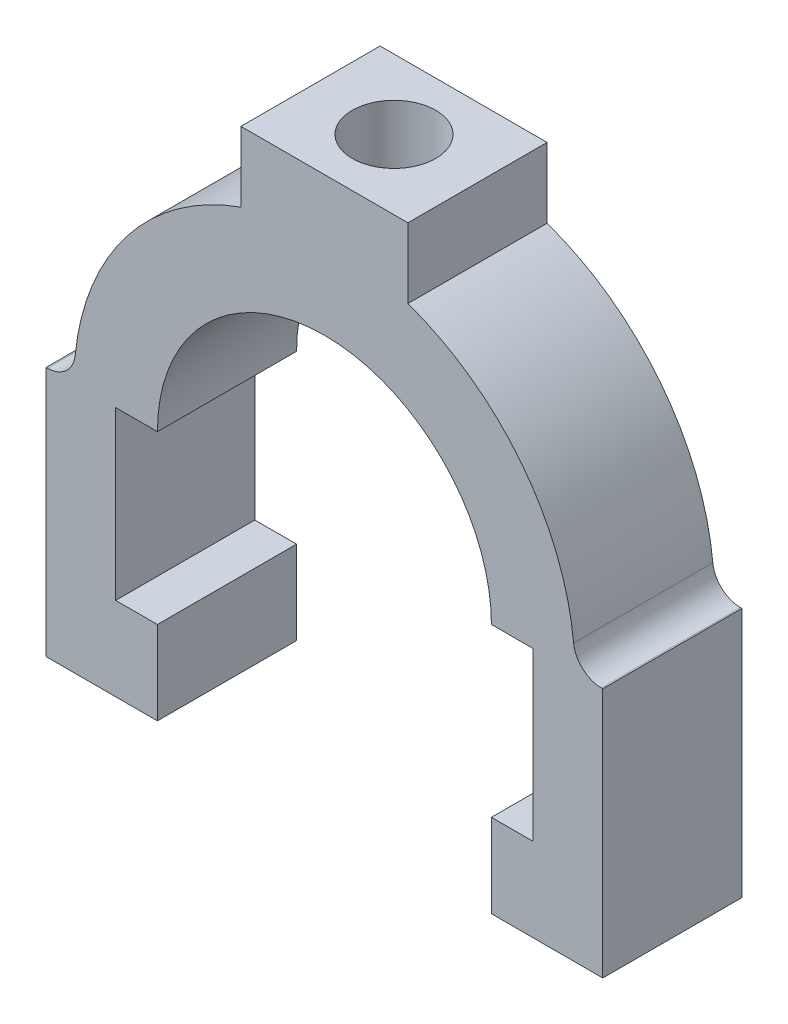
ISO-10303-21;
HEADER;
FILE_DESCRIPTION(('STEP AP214'),'2;1');
FILE_NAME('part.step','',(''),(''),'','','');
FILE_SCHEMA(('AUTOMOTIVE_DESIGN { 1 0 10303 214 1 1 1 1 }'));
ENDSEC;
DATA;
#1=APPLICATION_CONTEXT('core data for automotive mechanical design processes');
#2=APPLICATION_PROTOCOL_DEFINITION('international standard','automotive_design',2000,#1);
#3=PRODUCT_CONTEXT('',#1,'mechanical');
#4=PRODUCT('Part','Part','',(#3));
#5=PRODUCT_RELATED_PRODUCT_CATEGORY('part','',(#4));
#6=PRODUCT_DEFINITION_FORMATION('','',#4);
#7=PRODUCT_DEFINITION_CONTEXT('part definition',#1,'design');
#8=PRODUCT_DEFINITION('design','',#6,#7);
#9=PRODUCT_DEFINITION_SHAPE('','',#8);
#10=(LENGTH_UNIT() NAMED_UNIT(*) SI_UNIT(.MILLI.,.METRE.));
#11=(NAMED_UNIT(*) PLANE_ANGLE_UNIT() SI_UNIT($,.RADIAN.));
#12=(NAMED_UNIT(*) SI_UNIT($,.STERADIAN.) SOLID_ANGLE_UNIT());
#13=UNCERTAINTY_MEASURE_WITH_UNIT(LENGTH_MEASURE(1.E-05),#10,'distance_accuracy_value','');
#14=(GEOMETRIC_REPRESENTATION_CONTEXT(3) GLOBAL_UNCERTAINTY_ASSIGNED_CONTEXT((#13)) GLOBAL_UNIT_ASSIGNED_CONTEXT((#10,
#11,#12)) REPRESENTATION_CONTEXT('',''));
#15=CARTESIAN_POINT('',(0.,0.,0.));
#16=DIRECTION('',(0.,0.,1.));
#17=DIRECTION('',(1.,0.,0.));
#18=AXIS2_PLACEMENT_3D('',#15,#16,#17);
#19=CARTESIAN_POINT('',(0.,0.,-20.));
#20=DIRECTION('',(0.,-1.,0.));
#21=DIRECTION('',(1.,0.,0.));
#22=AXIS2_PLACEMENT_3D('',#19,#20,#21);
#23=PLANE('',#22);
#24=DIRECTION('',(1.,0.,0.));
#25=VECTOR('',#24,1.);
#26=CARTESIAN_POINT('',(0.,0.,0.));
#27=LINE('',#26,#25);
#28=CARTESIAN_POINT('',(-30.,0.,0.));
#29=VERTEX_POINT('',#28);
#30=CARTESIAN_POINT('',(-24.,0.,0.));
#31=VERTEX_POINT('',#30);
#32=EDGE_CURVE('E297',#29,#31,#27,.T.);
#33=ORIENTED_EDGE('',*,*,#32,.F.);
#34=DIRECTION('',(0.,0.,1.));
#35=VECTOR('',#34,1.);
#36=CARTESIAN_POINT('',(-30.,0.,-20.));
#37=LINE('',#36,#35);
#38=CARTESIAN_POINT('',(-30.,0.,-20.));
#39=VERTEX_POINT('',#38);
#40=EDGE_CURVE('E228',#39,#29,#37,.T.);
#41=ORIENTED_EDGE('',*,*,#40,.F.);
#42=DIRECTION('',(1.,0.,0.));
#43=VECTOR('',#42,1.);
#44=CARTESIAN_POINT('',(0.,0.,-20.));
#45=LINE('',#44,#43);
#46=CARTESIAN_POINT('',(-24.,0.,-20.));
#47=VERTEX_POINT('',#46);
#48=EDGE_CURVE('E222',#39,#47,#45,.T.);
#49=ORIENTED_EDGE('',*,*,#48,.T.);
#50=DIRECTION('',(0.,0.,1.));
#51=VECTOR('',#50,1.);
#52=CARTESIAN_POINT('',(-24.,0.,-20.));
#53=LINE('',#52,#51);
#54=EDGE_CURVE('E203',#47,#31,#53,.T.);
#55=ORIENTED_EDGE('',*,*,#54,.T.);
#56=EDGE_LOOP('',(#33,#41,#49,#55));
#57=FACE_BOUND('',#56,.T.);
#58=ADVANCED_FACE('F47',(#57),#23,.T.);
#59=CARTESIAN_POINT('',(-30.,0.,-20.));
#60=DIRECTION('',(1.,0.,0.));
#61=DIRECTION('',(0.,0.,-1.));
#62=AXIS2_PLACEMENT_3D('',#59,#60,#61);
#63=PLANE('',#62);
#64=DIRECTION('',(0.,1.,0.));
#65=VECTOR('',#64,1.);
#66=CARTESIAN_POINT('',(-30.,0.,0.));
#67=LINE('',#66,#65);
#68=CARTESIAN_POINT('',(-30.,-24.,0.));
#69=VERTEX_POINT('',#68);
#70=EDGE_CURVE('E230',#69,#29,#67,.T.);
#71=ORIENTED_EDGE('',*,*,#70,.F.);
#72=DIRECTION('',(0.,0.,1.));
#73=VECTOR('',#72,1.);
#74=CARTESIAN_POINT('',(-30.,-24.,-20.));
#75=LINE('',#74,#73);
#76=CARTESIAN_POINT('',(-30.,-24.,-20.));
#77=VERTEX_POINT('',#76);
#78=EDGE_CURVE('E363',#77,#69,#75,.T.);
#79=ORIENTED_EDGE('',*,*,#78,.F.);
#80=DIRECTION('',(0.,1.,0.));
#81=VECTOR('',#80,1.);
#82=CARTESIAN_POINT('',(-30.,0.,-20.));
#83=LINE('',#82,#81);
#84=EDGE_CURVE('E215',#77,#39,#83,.T.);
#85=ORIENTED_EDGE('',*,*,#84,.T.);
#86=ORIENTED_EDGE('',*,*,#40,.T.);
#87=EDGE_LOOP('',(#71,#79,#85,#86));
#88=FACE_BOUND('',#87,.T.);
#89=ADVANCED_FACE('F472',(#88),#63,.T.);
#90=CARTESIAN_POINT('',(0.,-24.,-20.));
#91=DIRECTION('',(0.,1.,0.));
#92=DIRECTION('',(-1.,0.,0.));
#93=AXIS2_PLACEMENT_3D('',#90,#91,#92);
#94=PLANE('',#93);
#95=DIRECTION('',(-1.,0.,0.));
#96=VECTOR('',#95,1.);
#97=CARTESIAN_POINT('',(0.,-24.,0.));
#98=LINE('',#97,#96);
#99=CARTESIAN_POINT('',(-24.,-24.,0.));
#100=VERTEX_POINT('',#99);
#101=EDGE_CURVE('E234',#100,#69,#98,.T.);
#102=ORIENTED_EDGE('',*,*,#101,.F.);
#103=DIRECTION('',(0.,0.,1.));
#104=VECTOR('',#103,1.);
#105=CARTESIAN_POINT('',(-24.,-24.,-20.));
#106=LINE('',#105,#104);
#107=CARTESIAN_POINT('',(-24.,-24.,-20.));
#108=VERTEX_POINT('',#107);
#109=EDGE_CURVE('E366',#108,#100,#106,.T.);
#110=ORIENTED_EDGE('',*,*,#109,.F.);
#111=DIRECTION('',(-1.,0.,0.));
#112=VECTOR('',#111,1.);
#113=CARTESIAN_POINT('',(0.,-24.,-20.));
#114=LINE('',#113,#112);
#115=EDGE_CURVE('E291',#108,#77,#114,.T.);
#116=ORIENTED_EDGE('',*,*,#115,.T.);
#117=ORIENTED_EDGE('',*,*,#78,.T.);
#118=EDGE_LOOP('',(#102,#110,#116,#117));
#119=FACE_BOUND('',#118,.T.);
#120=ADVANCED_FACE('F469',(#119),#94,.T.);
#121=CARTESIAN_POINT('',(-24.,0.,-20.));
#122=DIRECTION('',(1.,0.,0.));
#123=DIRECTION('',(0.,0.,-1.));
#124=AXIS2_PLACEMENT_3D('',#121,#122,#123);
#125=PLANE('',#124);
#126=DIRECTION('',(0.,1.,0.));
#127=VECTOR('',#126,1.);
#128=CARTESIAN_POINT('',(-24.,0.,0.));
#129=LINE('',#128,#127);
#130=CARTESIAN_POINT('',(-24.,-36.,0.));
#131=VERTEX_POINT('',#130);
#132=EDGE_CURVE('E353',#131,#100,#129,.T.);
#133=ORIENTED_EDGE('',*,*,#132,.F.);
#134=DIRECTION('',(0.,0.,1.));
#135=VECTOR('',#134,1.);
#136=CARTESIAN_POINT('',(-24.,-36.,-20.));
#137=LINE('',#136,#135);
#138=CARTESIAN_POINT('',(-24.,-36.,-20.));
#139=VERTEX_POINT('',#138);
#140=EDGE_CURVE('E369',#139,#131,#137,.T.);
#141=ORIENTED_EDGE('',*,*,#140,.F.);
#142=DIRECTION('',(0.,1.,0.));
#143=VECTOR('',#142,1.);
#144=CARTESIAN_POINT('',(-24.,0.,-20.));
#145=LINE('',#144,#143);
#146=EDGE_CURVE('E287',#139,#108,#145,.T.);
#147=ORIENTED_EDGE('',*,*,#146,.T.);
#148=ORIENTED_EDGE('',*,*,#109,.T.);
#149=EDGE_LOOP('',(#133,#141,#147,#148));
#150=FACE_BOUND('',#149,.T.);
#151=ADVANCED_FACE('F465',(#150),#125,.T.);
#152=CARTESIAN_POINT('',(0.,-36.,-20.));
#153=DIRECTION('',(0.,-1.,0.));
#154=DIRECTION('',(0.,0.,-1.));
#155=AXIS2_PLACEMENT_3D('',#152,#153,#154);
#156=PLANE('',#155);
#157=DIRECTION('',(1.,0.,0.));
#158=VECTOR('',#157,1.);
#159=CARTESIAN_POINT('',(0.,-36.,0.));
#160=LINE('',#159,#158);
#161=CARTESIAN_POINT('',(-40.,-36.,0.));
#162=VERTEX_POINT('',#161);
#163=EDGE_CURVE('E349',#162,#131,#160,.T.);
#164=ORIENTED_EDGE('',*,*,#163,.F.);
#165=DIRECTION('',(0.,0.,1.));
#166=VECTOR('',#165,1.);
#167=CARTESIAN_POINT('',(-40.,-36.,-20.));
#168=LINE('',#167,#166);
#169=CARTESIAN_POINT('',(-40.,-36.,-20.));
#170=VERTEX_POINT('',#169);
#171=EDGE_CURVE('E372',#170,#162,#168,.T.);
#172=ORIENTED_EDGE('',*,*,#171,.F.);
#173=DIRECTION('',(1.,0.,0.));
#174=VECTOR('',#173,1.);
#175=CARTESIAN_POINT('',(0.,-36.,-20.));
#176=LINE('',#175,#174);
#177=EDGE_CURVE('E283',#170,#139,#176,.T.);
#178=ORIENTED_EDGE('',*,*,#177,.T.);
#179=ORIENTED_EDGE('',*,*,#140,.T.);
#180=EDGE_LOOP('',(#164,#172,#178,#179));
#181=FACE_BOUND('',#180,.T.);
#182=ADVANCED_FACE('F461',(#181),#156,.T.);
#183=CARTESIAN_POINT('',(-40.,0.,-20.));
#184=DIRECTION('',(-1.,0.,0.));
#185=DIRECTION('',(0.,-1.,0.));
#186=AXIS2_PLACEMENT_3D('',#183,#184,#185);
#187=PLANE('',#186);
#188=DIRECTION('',(0.,-1.,0.));
#189=VECTOR('',#188,1.);
#190=CARTESIAN_POINT('',(-40.,0.,0.));
#191=LINE('',#190,#189);
#192=CARTESIAN_POINT('',(-40.,0.,0.));
#193=VERTEX_POINT('',#192);
#194=EDGE_CURVE('E345',#193,#162,#191,.T.);
#195=ORIENTED_EDGE('',*,*,#194,.F.);
#196=DIRECTION('',(0.,0.,1.));
#197=VECTOR('',#196,1.);
#198=CARTESIAN_POINT('',(-40.,0.,-20.));
#199=LINE('',#198,#197);
#200=CARTESIAN_POINT('',(-40.,0.,-20.));
#201=VERTEX_POINT('',#200);
#202=EDGE_CURVE('E375',#201,#193,#199,.T.);
#203=ORIENTED_EDGE('',*,*,#202,.F.);
#204=DIRECTION('',(0.,-1.,0.));
#205=VECTOR('',#204,1.);
#206=CARTESIAN_POINT('',(-40.,0.,-20.));
#207=LINE('',#206,#205);
#208=EDGE_CURVE('E279',#201,#170,#207,.T.);
#209=ORIENTED_EDGE('',*,*,#208,.T.);
#210=ORIENTED_EDGE('',*,*,#171,.T.);
#211=EDGE_LOOP('',(#195,#203,#209,#210));
#212=FACE_BOUND('',#211,.T.);
#213=ADVANCED_FACE('F457',(#212),#187,.T.);
#214=CARTESIAN_POINT('',(0.,0.,-20.));
#215=DIRECTION('',(0.,1.,0.));
#216=DIRECTION('',(-1.,0.,0.));
#217=AXIS2_PLACEMENT_3D('',#214,#215,#216);
#218=PLANE('',#217);
#219=DIRECTION('',(-1.,0.,0.));
#220=VECTOR('',#219,1.);
#221=CARTESIAN_POINT('',(0.,0.,0.));
#222=LINE('',#221,#220);
#223=CARTESIAN_POINT('',(-39.7994974842648,0.,0.));
#224=VERTEX_POINT('',#223);
#225=EDGE_CURVE('E342',#224,#193,#222,.T.);
#226=ORIENTED_EDGE('',*,*,#225,.F.);
#227=DIRECTION('',(0.,0.,1.));
#228=VECTOR('',#227,1.);
#229=CARTESIAN_POINT('',(-39.7994974842648,0.,-20.));
#230=LINE('',#229,#228);
#231=CARTESIAN_POINT('',(-39.7994974842648,0.,-20.));
#232=VERTEX_POINT('',#231);
#233=EDGE_CURVE('E421',#224,#232,#230,.F.);
#234=ORIENTED_EDGE('',*,*,#233,.T.);
#235=DIRECTION('',(-1.,0.,0.));
#236=VECTOR('',#235,1.);
#237=CARTESIAN_POINT('',(0.,0.,-20.));
#238=LINE('',#237,#236);
#239=EDGE_CURVE('E276',#232,#201,#238,.T.);
#240=ORIENTED_EDGE('',*,*,#239,.T.);
#241=ORIENTED_EDGE('',*,*,#202,.T.);
#242=EDGE_LOOP('',(#226,#234,#240,#241));
#243=FACE_BOUND('',#242,.T.);
#244=ADVANCED_FACE('F453',(#243),#218,.T.);
#245=CARTESIAN_POINT('',(0.,0.,-20.));
#246=DIRECTION('',(0.,0.,1.));
#247=DIRECTION('',(1.,0.,0.));
#248=AXIS2_PLACEMENT_3D('',#245,#246,#247);
#249=CYLINDRICAL_SURFACE('',#248,36.);
#250=CARTESIAN_POINT('',(0.,0.,-20.));
#251=DIRECTION('',(0.,0.,1.));
#252=DIRECTION('',(1.,0.,0.));
#253=AXIS2_PLACEMENT_3D('',#250,#251,#252);
#254=CIRCLE('',#253,36.);
#255=CARTESIAN_POINT('',(-35.8195477358383,3.6,-20.));
#256=VERTEX_POINT('',#255);
#257=CARTESIAN_POINT('',(-12.,33.9411254969543,-20.));
#258=VERTEX_POINT('',#257);
#259=EDGE_CURVE('E273',#256,#258,#254,.F.);
#260=ORIENTED_EDGE('',*,*,#259,.F.);
#261=DIRECTION('',(0.,0.,1.));
#262=VECTOR('',#261,1.);
#263=CARTESIAN_POINT('',(-35.8195477358383,3.6,-20.));
#264=LINE('',#263,#262);
#265=CARTESIAN_POINT('',(-35.8195477358383,3.6,0.));
#266=VERTEX_POINT('',#265);
#267=EDGE_CURVE('E362',#256,#266,#264,.T.);
#268=ORIENTED_EDGE('',*,*,#267,.T.);
#269=CARTESIAN_POINT('',(0.,0.,0.));
#270=DIRECTION('',(0.,0.,1.));
#271=DIRECTION('',(1.,0.,0.));
#272=AXIS2_PLACEMENT_3D('',#269,#270,#271);
#273=CIRCLE('',#272,36.);
#274=CARTESIAN_POINT('',(-12.,33.9411254969543,0.));
#275=VERTEX_POINT('',#274);
#276=EDGE_CURVE('E339',#266,#275,#273,.F.);
#277=ORIENTED_EDGE('',*,*,#276,.T.);
#278=DIRECTION('',(0.,0.,1.));
#279=VECTOR('',#278,1.);
#280=CARTESIAN_POINT('',(-12.,33.9411254969543,-20.));
#281=LINE('',#280,#279);
#282=EDGE_CURVE('E379',#258,#275,#281,.T.);
#283=ORIENTED_EDGE('',*,*,#282,.F.);
#284=EDGE_LOOP('',(#260,#268,#277,#283));
#285=FACE_BOUND('',#284,.T.);
#286=ADVANCED_FACE('F447',(#285),#249,.T.);
#287=CARTESIAN_POINT('',(-12.,0.,-20.));
#288=DIRECTION('',(-1.,0.,0.));
#289=DIRECTION('',(0.,-1.,0.));
#290=AXIS2_PLACEMENT_3D('',#287,#288,#289);
#291=PLANE('',#290);
#292=DIRECTION('',(0.,-1.,0.));
#293=VECTOR('',#292,1.);
#294=CARTESIAN_POINT('',(-12.,0.,0.));
#295=LINE('',#294,#293);
#296=CARTESIAN_POINT('',(-12.,44.,0.));
#297=VERTEX_POINT('',#296);
#298=EDGE_CURVE('E335',#297,#275,#295,.T.);
#299=ORIENTED_EDGE('',*,*,#298,.F.);
#300=DIRECTION('',(0.,0.,1.));
#301=VECTOR('',#300,1.);
#302=CARTESIAN_POINT('',(-12.,44.,-20.));
#303=LINE('',#302,#301);
#304=CARTESIAN_POINT('',(-12.,44.,-20.));
#305=VERTEX_POINT('',#304);
#306=EDGE_CURVE('E383',#305,#297,#303,.T.);
#307=ORIENTED_EDGE('',*,*,#306,.F.);
#308=DIRECTION('',(0.,-1.,0.));
#309=VECTOR('',#308,1.);
#310=CARTESIAN_POINT('',(-12.,0.,-20.));
#311=LINE('',#310,#309);
#312=EDGE_CURVE('E269',#305,#258,#311,.T.);
#313=ORIENTED_EDGE('',*,*,#312,.T.);
#314=ORIENTED_EDGE('',*,*,#282,.T.);
#315=EDGE_LOOP('',(#299,#307,#313,#314));
#316=FACE_BOUND('',#315,.T.);
#317=ADVANCED_FACE('F519',(#316),#291,.T.);
#318=CARTESIAN_POINT('',(0.,44.,-20.));
#319=DIRECTION('',(0.,1.,0.));
#320=DIRECTION('',(0.,0.,1.));
#321=AXIS2_PLACEMENT_3D('',#318,#319,#320);
#322=PLANE('',#321);
#323=CARTESIAN_POINT('',(0.,44.,-10.));
#324=DIRECTION('',(0.,1.,0.));
#325=DIRECTION('',(0.,0.,1.));
#326=AXIS2_PLACEMENT_3D('',#323,#324,#325);
#327=CIRCLE('',#326,6.);
#328=CARTESIAN_POINT('',(0.,44.,-4.));
#329=VERTEX_POINT('',#328);
#330=EDGE_CURVE('E237',#329,#329,#327,.T.);
#331=ORIENTED_EDGE('',*,*,#330,.F.);
#332=EDGE_LOOP('',(#331));
#333=FACE_BOUND('',#332,.T.);
#334=DIRECTION('',(-1.,0.,0.));
#335=VECTOR('',#334,1.);
#336=CARTESIAN_POINT('',(0.,44.,0.));
#337=LINE('',#336,#335);
#338=CARTESIAN_POINT('',(12.,44.,0.));
#339=VERTEX_POINT('',#338);
#340=EDGE_CURVE('E331',#339,#297,#337,.T.);
#341=ORIENTED_EDGE('',*,*,#340,.F.);
#342=DIRECTION('',(0.,0.,1.));
#343=VECTOR('',#342,1.);
#344=CARTESIAN_POINT('',(12.,44.,-20.));
#345=LINE('',#344,#343);
#346=CARTESIAN_POINT('',(12.,44.,-20.));
#347=VERTEX_POINT('',#346);
#348=EDGE_CURVE('E386',#347,#339,#345,.T.);
#349=ORIENTED_EDGE('',*,*,#348,.F.);
#350=DIRECTION('',(-1.,0.,0.));
#351=VECTOR('',#350,1.);
#352=CARTESIAN_POINT('',(0.,44.,-20.));
#353=LINE('',#352,#351);
#354=EDGE_CURVE('E265',#347,#305,#353,.T.);
#355=ORIENTED_EDGE('',*,*,#354,.T.);
#356=ORIENTED_EDGE('',*,*,#306,.T.);
#357=EDGE_LOOP('',(#341,#349,#355,#356));
#358=FACE_BOUND('',#357,.T.);
#359=ADVANCED_FACE('F516',(#333,#358),#322,.T.);
#360=CARTESIAN_POINT('',(12.,0.,-20.));
#361=DIRECTION('',(-1.,0.,0.));
#362=DIRECTION('',(0.,-1.,0.));
#363=AXIS2_PLACEMENT_3D('',#360,#361,#362);
#364=PLANE('',#363);
#365=DIRECTION('',(0.,-1.,0.));
#366=VECTOR('',#365,1.);
#367=CARTESIAN_POINT('',(12.,0.,0.));
#368=LINE('',#367,#366);
#369=CARTESIAN_POINT('',(12.,33.9411254969543,0.));
#370=VERTEX_POINT('',#369);
#371=EDGE_CURVE('E328',#339,#370,#368,.T.);
#372=ORIENTED_EDGE('',*,*,#371,.T.);
#373=DIRECTION('',(0.,0.,1.));
#374=VECTOR('',#373,1.);
#375=CARTESIAN_POINT('',(12.,33.9411254969543,-20.));
#376=LINE('',#375,#374);
#377=CARTESIAN_POINT('',(12.,33.9411254969543,-20.));
#378=VERTEX_POINT('',#377);
#379=EDGE_CURVE('E389',#378,#370,#376,.T.);
#380=ORIENTED_EDGE('',*,*,#379,.F.);
#381=DIRECTION('',(0.,-1.,0.));
#382=VECTOR('',#381,1.);
#383=CARTESIAN_POINT('',(12.,0.,-20.));
#384=LINE('',#383,#382);
#385=EDGE_CURVE('E262',#347,#378,#384,.T.);
#386=ORIENTED_EDGE('',*,*,#385,.F.);
#387=ORIENTED_EDGE('',*,*,#348,.T.);
#388=EDGE_LOOP('',(#372,#380,#386,#387));
#389=FACE_BOUND('',#388,.T.);
#390=ADVANCED_FACE('F527',(#389),#364,.F.);
#391=CARTESIAN_POINT('',(0.,0.,-20.));
#392=DIRECTION('',(0.,0.,1.));
#393=DIRECTION('',(1.,0.,0.));
#394=AXIS2_PLACEMENT_3D('',#391,#392,#393);
#395=CYLINDRICAL_SURFACE('',#394,36.);
#396=CARTESIAN_POINT('',(0.,0.,0.));
#397=DIRECTION('',(0.,0.,1.));
#398=DIRECTION('',(1.,0.,0.));
#399=AXIS2_PLACEMENT_3D('',#396,#397,#398);
#400=CIRCLE('',#399,36.);
#401=CARTESIAN_POINT('',(35.8195477358383,3.6,0.));
#402=VERTEX_POINT('',#401);
#403=EDGE_CURVE('E325',#370,#402,#400,.F.);
#404=ORIENTED_EDGE('',*,*,#403,.T.);
#405=DIRECTION('',(0.,0.,1.));
#406=VECTOR('',#405,1.);
#407=CARTESIAN_POINT('',(35.8195477358383,3.6,-20.));
#408=LINE('',#407,#406);
#409=CARTESIAN_POINT('',(35.8195477358383,3.6,-20.));
#410=VERTEX_POINT('',#409);
#411=EDGE_CURVE('E69',#402,#410,#408,.F.);
#412=ORIENTED_EDGE('',*,*,#411,.T.);
#413=CARTESIAN_POINT('',(0.,0.,-20.));
#414=DIRECTION('',(0.,0.,1.));
#415=DIRECTION('',(1.,0.,0.));
#416=AXIS2_PLACEMENT_3D('',#413,#414,#415);
#417=CIRCLE('',#416,36.);
#418=EDGE_CURVE('E259',#378,#410,#417,.F.);
#419=ORIENTED_EDGE('',*,*,#418,.F.);
#420=ORIENTED_EDGE('',*,*,#379,.T.);
#421=EDGE_LOOP('',(#404,#412,#419,#420));
#422=FACE_BOUND('',#421,.T.);
#423=ADVANCED_FACE('F511',(#422),#395,.T.);
#424=CARTESIAN_POINT('',(0.,0.,-20.));
#425=DIRECTION('',(0.,-1.,0.));
#426=DIRECTION('',(1.,0.,0.));
#427=AXIS2_PLACEMENT_3D('',#424,#425,#426);
#428=PLANE('',#427);
#429=DIRECTION('',(1.,0.,0.));
#430=VECTOR('',#429,1.);
#431=CARTESIAN_POINT('',(0.,0.,-20.));
#432=LINE('',#431,#430);
#433=CARTESIAN_POINT('',(39.7994974842648,0.,-20.));
#434=VERTEX_POINT('',#433);
#435=CARTESIAN_POINT('',(40.,0.,-20.));
#436=VERTEX_POINT('',#435);
#437=EDGE_CURVE('E256',#434,#436,#432,.T.);
#438=ORIENTED_EDGE('',*,*,#437,.F.);
#439=DIRECTION('',(0.,0.,-1.));
#440=VECTOR('',#439,1.);
#441=CARTESIAN_POINT('',(39.7994974842648,0.,0.));
#442=LINE('',#441,#440);
#443=CARTESIAN_POINT('',(39.7994974842648,0.,0.));
#444=VERTEX_POINT('',#443);
#445=EDGE_CURVE('E424',#434,#444,#442,.F.);
#446=ORIENTED_EDGE('',*,*,#445,.T.);
#447=DIRECTION('',(1.,0.,0.));
#448=VECTOR('',#447,1.);
#449=CARTESIAN_POINT('',(0.,0.,0.));
#450=LINE('',#449,#448);
#451=CARTESIAN_POINT('',(40.,0.,0.));
#452=VERTEX_POINT('',#451);
#453=EDGE_CURVE('E322',#444,#452,#450,.T.);
#454=ORIENTED_EDGE('',*,*,#453,.T.);
#455=DIRECTION('',(0.,0.,1.));
#456=VECTOR('',#455,1.);
#457=CARTESIAN_POINT('',(40.,0.,-20.));
#458=LINE('',#457,#456);
#459=EDGE_CURVE('E393',#436,#452,#458,.T.);
#460=ORIENTED_EDGE('',*,*,#459,.F.);
#461=EDGE_LOOP('',(#438,#446,#454,#460));
#462=FACE_BOUND('',#461,.T.);
#463=ADVANCED_FACE('F504',(#462),#428,.F.);
#464=CARTESIAN_POINT('',(40.,0.,-20.));
#465=DIRECTION('',(-1.,0.,0.));
#466=DIRECTION('',(0.,-1.,0.));
#467=AXIS2_PLACEMENT_3D('',#464,#465,#466);
#468=PLANE('',#467);
#469=DIRECTION('',(0.,-1.,0.));
#470=VECTOR('',#469,1.);
#471=CARTESIAN_POINT('',(40.,0.,0.));
#472=LINE('',#471,#470);
#473=CARTESIAN_POINT('',(40.,-36.,0.));
#474=VERTEX_POINT('',#473);
#475=EDGE_CURVE('E319',#452,#474,#472,.T.);
#476=ORIENTED_EDGE('',*,*,#475,.T.);
#477=DIRECTION('',(0.,0.,1.));
#478=VECTOR('',#477,1.);
#479=CARTESIAN_POINT('',(40.,-36.,-20.));
#480=LINE('',#479,#478);
#481=CARTESIAN_POINT('',(40.,-36.,-20.));
#482=VERTEX_POINT('',#481);
#483=EDGE_CURVE('E397',#482,#474,#480,.T.);
#484=ORIENTED_EDGE('',*,*,#483,.F.);
#485=DIRECTION('',(0.,-1.,0.));
#486=VECTOR('',#485,1.);
#487=CARTESIAN_POINT('',(40.,0.,-20.));
#488=LINE('',#487,#486);
#489=EDGE_CURVE('E253',#436,#482,#488,.T.);
#490=ORIENTED_EDGE('',*,*,#489,.F.);
#491=ORIENTED_EDGE('',*,*,#459,.T.);
#492=EDGE_LOOP('',(#476,#484,#490,#491));
#493=FACE_BOUND('',#492,.T.);
#494=ADVANCED_FACE('F500',(#493),#468,.F.);
#495=CARTESIAN_POINT('',(0.,-36.,-20.));
#496=DIRECTION('',(0.,1.,0.));
#497=DIRECTION('',(0.,0.,1.));
#498=AXIS2_PLACEMENT_3D('',#495,#496,#497);
#499=PLANE('',#498);
#500=DIRECTION('',(-1.,0.,0.));
#501=VECTOR('',#500,1.);
#502=CARTESIAN_POINT('',(0.,-36.,0.));
#503=LINE('',#502,#501);
#504=CARTESIAN_POINT('',(24.,-36.,0.));
#505=VERTEX_POINT('',#504);
#506=EDGE_CURVE('E316',#474,#505,#503,.T.);
#507=ORIENTED_EDGE('',*,*,#506,.T.);
#508=DIRECTION('',(0.,0.,1.));
#509=VECTOR('',#508,1.);
#510=CARTESIAN_POINT('',(24.,-36.,-20.));
#511=LINE('',#510,#509);
#512=CARTESIAN_POINT('',(24.,-36.,-20.));
#513=VERTEX_POINT('',#512);
#514=EDGE_CURVE('E401',#513,#505,#511,.T.);
#515=ORIENTED_EDGE('',*,*,#514,.F.);
#516=DIRECTION('',(-1.,0.,0.));
#517=VECTOR('',#516,1.);
#518=CARTESIAN_POINT('',(0.,-36.,-20.));
#519=LINE('',#518,#517);
#520=EDGE_CURVE('E250',#482,#513,#519,.T.);
#521=ORIENTED_EDGE('',*,*,#520,.F.);
#522=ORIENTED_EDGE('',*,*,#483,.T.);
#523=EDGE_LOOP('',(#507,#515,#521,#522));
#524=FACE_BOUND('',#523,.T.);
#525=ADVANCED_FACE('F496',(#524),#499,.F.);
#526=CARTESIAN_POINT('',(24.,0.,-20.));
#527=DIRECTION('',(1.,0.,0.));
#528=DIRECTION('',(0.,0.,-1.));
#529=AXIS2_PLACEMENT_3D('',#526,#527,#528);
#530=PLANE('',#529);
#531=DIRECTION('',(0.,1.,0.));
#532=VECTOR('',#531,1.);
#533=CARTESIAN_POINT('',(24.,0.,0.));
#534=LINE('',#533,#532);
#535=CARTESIAN_POINT('',(24.,-24.,0.));
#536=VERTEX_POINT('',#535);
#537=EDGE_CURVE('E313',#505,#536,#534,.T.);
#538=ORIENTED_EDGE('',*,*,#537,.T.);
#539=DIRECTION('',(0.,0.,1.));
#540=VECTOR('',#539,1.);
#541=CARTESIAN_POINT('',(24.,-24.,-20.));
#542=LINE('',#541,#540);
#543=CARTESIAN_POINT('',(24.,-24.,-20.));
#544=VERTEX_POINT('',#543);
#545=EDGE_CURVE('E405',#544,#536,#542,.T.);
#546=ORIENTED_EDGE('',*,*,#545,.F.);
#547=DIRECTION('',(0.,1.,0.));
#548=VECTOR('',#547,1.);
#549=CARTESIAN_POINT('',(24.,0.,-20.));
#550=LINE('',#549,#548);
#551=EDGE_CURVE('E247',#513,#544,#550,.T.);
#552=ORIENTED_EDGE('',*,*,#551,.F.);
#553=ORIENTED_EDGE('',*,*,#514,.T.);
#554=EDGE_LOOP('',(#538,#546,#552,#553));
#555=FACE_BOUND('',#554,.T.);
#556=ADVANCED_FACE('F491',(#555),#530,.F.);
#557=CARTESIAN_POINT('',(0.,-24.,-20.));
#558=DIRECTION('',(0.,-1.,0.));
#559=DIRECTION('',(1.,0.,0.));
#560=AXIS2_PLACEMENT_3D('',#557,#558,#559);
#561=PLANE('',#560);
#562=DIRECTION('',(1.,0.,0.));
#563=VECTOR('',#562,1.);
#564=CARTESIAN_POINT('',(0.,-24.,0.));
#565=LINE('',#564,#563);
#566=CARTESIAN_POINT('',(30.,-24.,0.));
#567=VERTEX_POINT('',#566);
#568=EDGE_CURVE('E310',#536,#567,#565,.T.);
#569=ORIENTED_EDGE('',*,*,#568,.T.);
#570=DIRECTION('',(0.,0.,1.));
#571=VECTOR('',#570,1.);
#572=CARTESIAN_POINT('',(30.,-24.,-20.));
#573=LINE('',#572,#571);
#574=CARTESIAN_POINT('',(30.,-24.,-20.));
#575=VERTEX_POINT('',#574);
#576=EDGE_CURVE('E409',#575,#567,#573,.T.);
#577=ORIENTED_EDGE('',*,*,#576,.F.);
#578=DIRECTION('',(1.,0.,0.));
#579=VECTOR('',#578,1.);
#580=CARTESIAN_POINT('',(0.,-24.,-20.));
#581=LINE('',#580,#579);
#582=EDGE_CURVE('E244',#544,#575,#581,.T.);
#583=ORIENTED_EDGE('',*,*,#582,.F.);
#584=ORIENTED_EDGE('',*,*,#545,.T.);
#585=EDGE_LOOP('',(#569,#577,#583,#584));
#586=FACE_BOUND('',#585,.T.);
#587=ADVANCED_FACE('F485',(#586),#561,.F.);
#588=CARTESIAN_POINT('',(30.,0.,-20.));
#589=DIRECTION('',(1.,0.,0.));
#590=DIRECTION('',(0.,0.,-1.));
#591=AXIS2_PLACEMENT_3D('',#588,#589,#590);
#592=PLANE('',#591);
#593=DIRECTION('',(0.,1.,0.));
#594=VECTOR('',#593,1.);
#595=CARTESIAN_POINT('',(30.,0.,0.));
#596=LINE('',#595,#594);
#597=CARTESIAN_POINT('',(30.,0.,0.));
#598=VERTEX_POINT('',#597);
#599=EDGE_CURVE('E306',#567,#598,#596,.T.);
#600=ORIENTED_EDGE('',*,*,#599,.T.);
#601=DIRECTION('',(0.,0.,1.));
#602=VECTOR('',#601,1.);
#603=CARTESIAN_POINT('',(30.,0.,-20.));
#604=LINE('',#603,#602);
#605=CARTESIAN_POINT('',(30.,0.,-20.));
#606=VERTEX_POINT('',#605);
#607=EDGE_CURVE('E413',#606,#598,#604,.T.);
#608=ORIENTED_EDGE('',*,*,#607,.F.);
#609=DIRECTION('',(0.,1.,0.));
#610=VECTOR('',#609,1.);
#611=CARTESIAN_POINT('',(30.,0.,-20.));
#612=LINE('',#611,#610);
#613=EDGE_CURVE('E241',#575,#606,#612,.T.);
#614=ORIENTED_EDGE('',*,*,#613,.F.);
#615=ORIENTED_EDGE('',*,*,#576,.T.);
#616=EDGE_LOOP('',(#600,#608,#614,#615));
#617=FACE_BOUND('',#616,.T.);
#618=ADVANCED_FACE('F481',(#617),#592,.F.);
#619=CARTESIAN_POINT('',(0.,0.,-20.));
#620=DIRECTION('',(0.,-1.,0.));
#621=DIRECTION('',(1.,0.,0.));
#622=AXIS2_PLACEMENT_3D('',#619,#620,#621);
#623=PLANE('',#622);
#624=DIRECTION('',(1.,0.,0.));
#625=VECTOR('',#624,1.);
#626=CARTESIAN_POINT('',(0.,0.,0.));
#627=LINE('',#626,#625);
#628=CARTESIAN_POINT('',(24.,0.,0.));
#629=VERTEX_POINT('',#628);
#630=EDGE_CURVE('E302',#629,#598,#627,.T.);
#631=ORIENTED_EDGE('',*,*,#630,.F.);
#632=DIRECTION('',(0.,0.,1.));
#633=VECTOR('',#632,1.);
#634=CARTESIAN_POINT('',(24.,0.,-20.));
#635=LINE('',#634,#633);
#636=CARTESIAN_POINT('',(24.,0.,-20.));
#637=VERTEX_POINT('',#636);
#638=EDGE_CURVE('E214',#637,#629,#635,.T.);
#639=ORIENTED_EDGE('',*,*,#638,.F.);
#640=DIRECTION('',(1.,0.,0.));
#641=VECTOR('',#640,1.);
#642=CARTESIAN_POINT('',(0.,0.,-20.));
#643=LINE('',#642,#641);
#644=EDGE_CURVE('E225',#637,#606,#643,.T.);
#645=ORIENTED_EDGE('',*,*,#644,.T.);
#646=ORIENTED_EDGE('',*,*,#607,.T.);
#647=EDGE_LOOP('',(#631,#639,#645,#646));
#648=FACE_BOUND('',#647,.T.);
#649=ADVANCED_FACE('F477',(#648),#623,.T.);
#650=CARTESIAN_POINT('',(0.,0.,-20.));
#651=DIRECTION('',(0.,0.,1.));
#652=DIRECTION('',(1.,0.,0.));
#653=AXIS2_PLACEMENT_3D('',#650,#651,#652);
#654=CYLINDRICAL_SURFACE('',#653,24.);
#655=CARTESIAN_POINT('',(0.,24.,-4.));
#656=CARTESIAN_POINT('',(-0.165805387403802,24.0000029962766,-3.99999505102641));
#657=CARTESIAN_POINT('',(-0.331556618095783,23.9982792337243,-4.00687387489243));
#658=CARTESIAN_POINT('',(-0.661898341499741,23.9914389070726,-4.03431986201637));
#659=CARTESIAN_POINT('',(-0.82648869961224,23.9863219558732,-4.05488858704015));
#660=CARTESIAN_POINT('',(-1.15331468289425,23.9728312747807,-4.10955571939549));
#661=CARTESIAN_POINT('',(-1.31554956136034,23.964456534561,-4.14365832400845));
#662=CARTESIAN_POINT('',(-1.63652999353389,23.9446785682942,-4.22512392789649));
#663=CARTESIAN_POINT('',(-1.7952742379173,23.9332742261501,-4.27249181441513));
#664=CARTESIAN_POINT('',(-2.10785890827135,23.9077704080524,-4.38001719827038));
#665=CARTESIAN_POINT('',(-2.26170674963502,23.8936752583917,-4.44015418258225));
#666=CARTESIAN_POINT('',(-2.56378623821258,23.8631527081916,-4.57282541021577));
#667=CARTESIAN_POINT('',(-2.71201578712804,23.8467244469549,-4.64536423066248));
#668=CARTESIAN_POINT('',(-3.00177661033544,23.8119848981805,-4.80226274512907));
#669=CARTESIAN_POINT('',(-3.1433102969363,23.7936742964516,-4.88661813795178));
#670=CARTESIAN_POINT('',(-3.41888526654491,23.7556431475739,-5.06661176459039));
#671=CARTESIAN_POINT('',(-3.5529237053449,23.7359220715781,-5.1622542392442));
#672=CARTESIAN_POINT('',(-3.81496434602383,23.6952304700178,-5.36598591724915));
#673=CARTESIAN_POINT('',(-3.94281308913214,23.674243775966,-5.47426931255561));
#674=CARTESIAN_POINT('',(-4.18902736841679,23.6319204183454,-5.70115303311099));
#675=CARTESIAN_POINT('',(-4.30738936846955,23.6105836278175,-5.8197571713109));
#676=CARTESIAN_POINT('',(-4.53377489524013,23.568159620478,-6.06643888329868));
#677=CARTESIAN_POINT('',(-4.64180103185486,23.5470723418473,-6.19451405100954));
#678=CARTESIAN_POINT('',(-4.84686316299839,23.5057198367545,-6.45938141653677));
#679=CARTESIAN_POINT('',(-4.94389508557169,23.4854549166434,-6.59617681496597));
#680=CARTESIAN_POINT('',(-5.12757579334232,23.4460427828086,-6.87960061394558));
#681=CARTESIAN_POINT('',(-5.21405329073272,23.4269160793509,-7.02634297896338));
#682=CARTESIAN_POINT('',(-5.37434099239073,23.3906650895731,-7.32689631114159));
#683=CARTESIAN_POINT('',(-5.4481464054103,23.3735415614194,-7.48070992415988));
#684=CARTESIAN_POINT('',(-5.5824381696205,23.3418328254504,-7.79422880998301));
#685=CARTESIAN_POINT('',(-5.64293112700069,23.3272463593972,-7.95393111442795));
#686=CARTESIAN_POINT('',(-5.75016256060697,23.301043510543,-8.27812298906709));
#687=CARTESIAN_POINT('',(-5.79689611131117,23.2894281915328,-8.4426142504887));
#688=CARTESIAN_POINT('',(-5.91415157316671,23.2600431044562,-8.93482169258661));
#689=CARTESIAN_POINT('',(-5.96458986092324,23.2470332112981,-9.26798361707615));
#690=CARTESIAN_POINT('',(-5.99795848349603,23.23842608856,-9.77014845136033));
#691=CARTESIAN_POINT('',(-6.00202663613951,23.2373766993858,-9.93800547716951));
#692=CARTESIAN_POINT('',(-5.99610970800768,23.2389046091482,-10.2734756491558));
#693=CARTESIAN_POINT('',(-5.98612448822743,23.2414819439575,-10.4410887929042));
#694=CARTESIAN_POINT('',(-5.93594713474591,23.2543754061852,-10.9334757617709));
#695=CARTESIAN_POINT('',(-5.87607363848321,23.2697164452628,-11.2563322349699));
#696=CARTESIAN_POINT('',(-5.70489646981085,23.3122664593645,-11.8870944582585));
#697=CARTESIAN_POINT('',(-5.59358913348967,23.3394762798586,-12.1949991415238));
#698=CARTESIAN_POINT('',(-5.32155798729425,23.4030050803747,-12.7909383990231));
#699=CARTESIAN_POINT('',(-5.16034668919655,23.4394132393811,-13.0787410216454));
#700=CARTESIAN_POINT('',(-4.79342508379137,23.5171882932266,-13.623678505182));
#701=CARTESIAN_POINT('',(-4.58770698972655,23.5585560552156,-13.8808079874003));
#702=CARTESIAN_POINT('',(-4.13065370439076,23.6430352608536,-14.3648134392708));
#703=CARTESIAN_POINT('',(-3.8781850342093,23.6861627896442,-14.5906176860606));
#704=CARTESIAN_POINT('',(-3.33844766846889,23.7682386126258,-14.9968852440488));
#705=CARTESIAN_POINT('',(-3.05117791031428,23.8071867791381,-15.1773471702746));
#706=CARTESIAN_POINT('',(-2.44846355524484,23.8767092866156,-15.4882022714257));
#707=CARTESIAN_POINT('',(-2.13292557335861,23.9072544059235,-15.6184213427058));
#708=CARTESIAN_POINT('',(-1.48350403204752,23.9563166788424,-15.8236692411467));
#709=CARTESIAN_POINT('',(-1.14962399502517,23.9748361331613,-15.8987086254555));
#710=CARTESIAN_POINT('',(-0.482159883096529,23.9974199712544,-15.9898302624469));
#711=CARTESIAN_POINT('',(-0.148786885522351,24.0018421411353,-16.0073721225199));
#712=CARTESIAN_POINT('',(0.516131504775039,23.9967521917739,-15.987003973561));
#713=CARTESIAN_POINT('',(0.847677059317267,23.987241326857,-15.94909895615));
#714=CARTESIAN_POINT('',(1.4944570546744,23.9555832478693,-15.8201164380113));
#715=CARTESIAN_POINT('',(1.80986040015949,23.9336253776701,-15.7298352125968));
#716=CARTESIAN_POINT('',(2.42102924553322,23.8795482551267,-15.4995713973546));
#717=CARTESIAN_POINT('',(2.71679275860286,23.8474279766146,-15.3595837881582));
#718=CARTESIAN_POINT('',(3.28609225023473,23.775732355911,-15.0310564967388));
#719=CARTESIAN_POINT('',(3.5591406856365,23.7360348408855,-14.8416993592124));
#720=CARTESIAN_POINT('',(4.07010753646662,23.6537802212633,-14.4208365553548));
#721=CARTESIAN_POINT('',(4.30801987625634,23.6112226239559,-14.1893236149746));
#722=CARTESIAN_POINT('',(4.74795813275242,23.526758837948,-13.6840067323829));
#723=CARTESIAN_POINT('',(4.94895984477464,23.4848942795269,-13.4093042078171));
#724=CARTESIAN_POINT('',(5.30205866107054,23.4077130231476,-12.8290144447531));
#725=CARTESIAN_POINT('',(5.45415793615243,23.3723960345683,-12.5234285779765));
#726=CARTESIAN_POINT('',(5.64160870712871,23.3275859445682,-12.0496398809846));
#727=CARTESIAN_POINT('',(5.69722158138527,23.314033661875,-11.8895567217037));
#728=CARTESIAN_POINT('',(5.79475769208555,23.2899834650234,-11.5650651703049));
#729=CARTESIAN_POINT('',(5.83668611505733,23.2794843938355,-11.4006584424464));
#730=CARTESIAN_POINT('',(5.9064899745362,23.2618715740422,-11.0687170513407));
#731=CARTESIAN_POINT('',(5.93436517338602,23.2547578826878,-10.901182335245));
#732=CARTESIAN_POINT('',(5.97582085063046,23.2441396190328,-10.5642421336349));
#733=CARTESIAN_POINT('',(5.98940200008078,23.2406348773048,-10.3948367363199));
#734=CARTESIAN_POINT('',(6.00196347285349,23.2373938489065,-10.060331055056));
#735=CARTESIAN_POINT('',(6.0013522054121,23.2375521518778,-9.89524696865287));
#736=CARTESIAN_POINT('',(5.98653576306369,23.2413736324535,-9.56573349984315));
#737=CARTESIAN_POINT('',(5.97233089751311,23.2450367302975,-9.401304102623));
#738=CARTESIAN_POINT('',(5.93044575509701,23.2557579721328,-9.07425896558781));
#739=CARTESIAN_POINT('',(5.90276341290372,23.2628166364686,-8.91164350765424));
#740=CARTESIAN_POINT('',(5.83416667908453,23.2801148571724,-8.58946233314158));
#741=CARTESIAN_POINT('',(5.79325695086328,23.2903532924404,-8.42989556269427));
#742=CARTESIAN_POINT('',(5.69880203716712,23.313644179093,-8.11574761367387));
#743=CARTESIAN_POINT('',(5.64532943643257,23.3266804293978,-7.96114338738971));
#744=CARTESIAN_POINT('',(5.52605852883571,23.3552228194459,-7.65706577641292));
#745=CARTESIAN_POINT('',(5.46026449802037,23.3707281020539,-7.50759063294574));
#746=CARTESIAN_POINT('',(5.31678835542035,23.4037855982137,-7.21461325501313));
#747=CARTESIAN_POINT('',(5.23910089912543,23.4213387311534,-7.07111374285786));
#748=CARTESIAN_POINT('',(5.07243073970643,23.4579990976357,-6.79110854339097));
#749=CARTESIAN_POINT('',(4.98345174049215,23.4771058208267,-6.65460058319193));
#750=CARTESIAN_POINT('',(4.7922729032838,23.5168854335111,-6.38585732091633));
#751=CARTESIAN_POINT('',(4.68978556121475,23.5375863850894,-6.2538306167794));
#752=CARTESIAN_POINT('',(4.4742434518464,23.579507882839,-5.99887487156699));
#753=CARTESIAN_POINT('',(4.36119228671727,23.6007282500856,-5.87594275475177));
#754=CARTESIAN_POINT('',(4.12516419546941,23.6431258862839,-5.63985111466564));
#755=CARTESIAN_POINT('',(4.0021814457299,23.6643031223737,-5.52669740687928));
#756=CARTESIAN_POINT('',(3.74719176501411,23.7060168559164,-5.31103132209644));
#757=CARTESIAN_POINT('',(3.61518813420472,23.7265535837286,-5.2085150877252));
#758=CARTESIAN_POINT('',(3.34044186706076,23.7668061369628,-5.0129768060556));
#759=CARTESIAN_POINT('',(3.19754553860501,23.7864996932668,-4.92016593894123));
#760=CARTESIAN_POINT('',(2.90425652857033,23.824087485808,-4.74697329866601));
#761=CARTESIAN_POINT('',(2.75386663022822,23.8419823827553,-4.66658695566752));
#762=CARTESIAN_POINT('',(2.44663692885418,23.8754647710401,-4.51885051284106));
#763=CARTESIAN_POINT('',(2.2897999415517,23.8910532562916,-4.45149479378778));
#764=CARTESIAN_POINT('',(1.97079001830644,23.9194829588902,-4.33033364450709));
#765=CARTESIAN_POINT('',(1.80861789148403,23.9323245906257,-4.27652617018404));
#766=CARTESIAN_POINT('',(1.3777763047293,23.9619049568243,-4.15376714609566));
#767=CARTESIAN_POINT('',(1.1055914726577,23.9761014751911,-4.09620462215925));
#768=CARTESIAN_POINT('',(0.555553502444542,23.9951461360495,-4.01932663186095));
#769=CARTESIAN_POINT('',(0.277700792219542,23.9999949816564,-4.00000828883734));
#770=CARTESIAN_POINT('',(0.,24.,-4.));
#771=B_SPLINE_CURVE_WITH_KNOTS('',3,(#655,#656,#657,#658,#659,#660,#661,#662,#663,#664,#665,
#666,#667,#668,#669,#670,#671,#672,#673,#674,#675,#676,#677,#678,#679,#680,#681,#682,#683,#684,
#685,#686,#687,#688,#689,#690,#691,#692,#693,#694,#695,#696,#697,#698,#699,#700,#701,#702,#703,
#704,#705,#706,#707,#708,#709,#710,#711,#712,#713,#714,#715,#716,#717,#718,#719,#720,#721,#722,
#723,#724,#725,#726,#727,#728,#729,#730,#731,#732,#733,#734,#735,#736,#737,#738,#739,#740,#741,
#742,#743,#744,#745,#746,#747,#748,#749,#750,#751,#752,#753,#754,#755,#756,#757,#758,#759,#760,
#761,#762,#763,#764,#765,#766,#767,#768,#769,#770),.UNSPECIFIED.,.T.,.F.,(4,2,2,2,2,2,2,2,2,2,2,
2,2,2,2,2,2,2,2,2,2,2,2,2,2,2,2,2,2,2,2,2,2,2,2,2,2,2,2,2,2,2,2,2,2,2,2,2,2,2,2,2,2,2,2,2,2,4),
(0.,0.497171453608337,0.994399635056342,1.49178214324908,1.98934814054333,2.48612078574438,
2.98307717135302,3.47985313409878,3.97681634579052,4.48278784834555,4.98894707988207,
5.49497816255321,6.00119605682159,6.51476681838441,7.02853133276356,7.54204031819884,
8.0557329040678,9.06140626133585,9.56463055957972,10.0678598353591,11.0489981911534,
12.0302064495334,13.021319425847,14.0126059443383,15.0321583496526,16.0517418932217,
17.0748274712564,18.0977172584375,19.0944306688629,20.0910543554015,21.0729092914533,
22.0548634037835,23.0542418135059,24.0537928312126,25.0778786790709,26.1019190608722,
26.6114255778037,27.1207387624019,27.6300605598219,28.1393584452954,28.6340191333343,
29.1286685643954,29.6233938208458,30.1179448483897,30.6097058740945,31.10129655354,
31.593108789452,32.0847601135969,32.5894192432003,33.0939069121446,33.5986925778495,
34.1032945530712,34.6172488082311,35.1310135748031,35.6445562931573,36.1580214841036,
36.9907766489356,37.8234691729712),.UNSPECIFIED.);
#772=CARTESIAN_POINT('',(0.,24.,-4.));
#773=VERTEX_POINT('',#772);
#774=EDGE_CURVE('E51',#773,#773,#771,.T.);
#775=ORIENTED_EDGE('',*,*,#774,.F.);
#776=EDGE_LOOP('',(#775));
#777=FACE_BOUND('',#776,.T.);
#778=CARTESIAN_POINT('',(0.,0.,0.));
#779=DIRECTION('',(0.,0.,1.));
#780=DIRECTION('',(1.,0.,0.));
#781=AXIS2_PLACEMENT_3D('',#778,#779,#780);
#782=CIRCLE('',#781,24.);
#783=EDGE_CURVE('E208',#31,#629,#782,.F.);
#784=ORIENTED_EDGE('',*,*,#783,.F.);
#785=ORIENTED_EDGE('',*,*,#54,.F.);
#786=CARTESIAN_POINT('',(0.,0.,-20.));
#787=DIRECTION('',(0.,0.,1.));
#788=DIRECTION('',(1.,0.,0.));
#789=AXIS2_PLACEMENT_3D('',#786,#787,#788);
#790=CIRCLE('',#789,24.);
#791=EDGE_CURVE('E206',#47,#637,#790,.F.);
#792=ORIENTED_EDGE('',*,*,#791,.T.);
#793=ORIENTED_EDGE('',*,*,#638,.T.);
#794=EDGE_LOOP('',(#784,#785,#792,#793));
#795=FACE_BOUND('',#794,.T.);
#796=ADVANCED_FACE('F205',(#777,#795),#654,.F.);
#797=CARTESIAN_POINT('',(0.,0.,-20.));
#798=DIRECTION('',(0.,0.,1.));
#799=DIRECTION('',(1.,0.,0.));
#800=AXIS2_PLACEMENT_3D('',#797,#798,#799);
#801=PLANE('',#800);
#802=ORIENTED_EDGE('',*,*,#48,.F.);
#803=ORIENTED_EDGE('',*,*,#84,.F.);
#804=ORIENTED_EDGE('',*,*,#115,.F.);
#805=ORIENTED_EDGE('',*,*,#146,.F.);
#806=ORIENTED_EDGE('',*,*,#177,.F.);
#807=ORIENTED_EDGE('',*,*,#208,.F.);
#808=ORIENTED_EDGE('',*,*,#239,.F.);
#809=CARTESIAN_POINT('',(-39.7994974842648,4.,-20.));
#810=DIRECTION('',(0.,0.,1.));
#811=DIRECTION('',(1.,0.,0.));
#812=AXIS2_PLACEMENT_3D('',#809,#810,#811);
#813=CIRCLE('',#812,4.);
#814=EDGE_CURVE('E433',#232,#256,#813,.T.);
#815=ORIENTED_EDGE('',*,*,#814,.T.);
#816=ORIENTED_EDGE('',*,*,#259,.T.);
#817=ORIENTED_EDGE('',*,*,#312,.F.);
#818=ORIENTED_EDGE('',*,*,#354,.F.);
#819=ORIENTED_EDGE('',*,*,#385,.T.);
#820=ORIENTED_EDGE('',*,*,#418,.T.);
#821=CARTESIAN_POINT('',(39.7994974842648,4.,-20.));
#822=DIRECTION('',(0.,0.,1.));
#823=DIRECTION('',(1.,0.,0.));
#824=AXIS2_PLACEMENT_3D('',#821,#822,#823);
#825=CIRCLE('',#824,4.);
#826=EDGE_CURVE('E11',#410,#434,#825,.T.);
#827=ORIENTED_EDGE('',*,*,#826,.T.);
#828=ORIENTED_EDGE('',*,*,#437,.T.);
#829=ORIENTED_EDGE('',*,*,#489,.T.);
#830=ORIENTED_EDGE('',*,*,#520,.T.);
#831=ORIENTED_EDGE('',*,*,#551,.T.);
#832=ORIENTED_EDGE('',*,*,#582,.T.);
#833=ORIENTED_EDGE('',*,*,#613,.T.);
#834=ORIENTED_EDGE('',*,*,#644,.F.);
#835=ORIENTED_EDGE('',*,*,#791,.F.);
#836=EDGE_LOOP('',(#802,#803,#804,#805,#806,#807,#808,#815,#816,#817,#818,#819,#820,#827,#828,
#829,#830,#831,#832,#833,#834,#835));
#837=FACE_BOUND('',#836,.T.);
#838=ADVANCED_FACE('F220',(#837),#801,.F.);
#839=CARTESIAN_POINT('',(0.,0.,0.));
#840=DIRECTION('',(0.,0.,1.));
#841=DIRECTION('',(1.,0.,0.));
#842=AXIS2_PLACEMENT_3D('',#839,#840,#841);
#843=PLANE('',#842);
#844=ORIENTED_EDGE('',*,*,#32,.T.);
#845=ORIENTED_EDGE('',*,*,#783,.T.);
#846=ORIENTED_EDGE('',*,*,#630,.T.);
#847=ORIENTED_EDGE('',*,*,#599,.F.);
#848=ORIENTED_EDGE('',*,*,#568,.F.);
#849=ORIENTED_EDGE('',*,*,#537,.F.);
#850=ORIENTED_EDGE('',*,*,#506,.F.);
#851=ORIENTED_EDGE('',*,*,#475,.F.);
#852=ORIENTED_EDGE('',*,*,#453,.F.);
#853=CARTESIAN_POINT('',(39.7994974842648,4.,0.));
#854=DIRECTION('',(0.,0.,1.));
#855=DIRECTION('',(1.,0.,0.));
#856=AXIS2_PLACEMENT_3D('',#853,#854,#855);
#857=CIRCLE('',#856,4.);
#858=EDGE_CURVE('E62',#444,#402,#857,.F.);
#859=ORIENTED_EDGE('',*,*,#858,.T.);
#860=ORIENTED_EDGE('',*,*,#403,.F.);
#861=ORIENTED_EDGE('',*,*,#371,.F.);
#862=ORIENTED_EDGE('',*,*,#340,.T.);
#863=ORIENTED_EDGE('',*,*,#298,.T.);
#864=ORIENTED_EDGE('',*,*,#276,.F.);
#865=CARTESIAN_POINT('',(-39.7994974842648,4.,0.));
#866=DIRECTION('',(0.,0.,1.));
#867=DIRECTION('',(1.,0.,0.));
#868=AXIS2_PLACEMENT_3D('',#865,#866,#867);
#869=CIRCLE('',#868,4.);
#870=EDGE_CURVE('E430',#266,#224,#869,.F.);
#871=ORIENTED_EDGE('',*,*,#870,.T.);
#872=ORIENTED_EDGE('',*,*,#225,.T.);
#873=ORIENTED_EDGE('',*,*,#194,.T.);
#874=ORIENTED_EDGE('',*,*,#163,.T.);
#875=ORIENTED_EDGE('',*,*,#132,.T.);
#876=ORIENTED_EDGE('',*,*,#101,.T.);
#877=ORIENTED_EDGE('',*,*,#70,.T.);
#878=EDGE_LOOP('',(#844,#845,#846,#847,#848,#849,#850,#851,#852,#859,#860,#861,#862,#863,#864,
#871,#872,#873,#874,#875,#876,#877));
#879=FACE_BOUND('',#878,.T.);
#880=ADVANCED_FACE('F451',(#879),#843,.T.);
#881=CARTESIAN_POINT('',(-39.7994974842648,4.,-20.));
#882=DIRECTION('',(0.,0.,1.));
#883=DIRECTION('',(1.,0.,0.));
#884=AXIS2_PLACEMENT_3D('',#881,#882,#883);
#885=CYLINDRICAL_SURFACE('',#884,4.);
#886=ORIENTED_EDGE('',*,*,#814,.F.);
#887=ORIENTED_EDGE('',*,*,#233,.F.);
#888=ORIENTED_EDGE('',*,*,#870,.F.);
#889=ORIENTED_EDGE('',*,*,#267,.F.);
#890=EDGE_LOOP('',(#886,#887,#888,#889));
#891=FACE_BOUND('',#890,.T.);
#892=ADVANCED_FACE('F449',(#891),#885,.F.);
#893=CARTESIAN_POINT('',(39.7994974842648,4.,-20.));
#894=DIRECTION('',(0.,0.,1.));
#895=DIRECTION('',(1.,0.,0.));
#896=AXIS2_PLACEMENT_3D('',#893,#894,#895);
#897=CYLINDRICAL_SURFACE('',#896,4.);
#898=ORIENTED_EDGE('',*,*,#826,.F.);
#899=ORIENTED_EDGE('',*,*,#411,.F.);
#900=ORIENTED_EDGE('',*,*,#858,.F.);
#901=ORIENTED_EDGE('',*,*,#445,.F.);
#902=EDGE_LOOP('',(#898,#899,#900,#901));
#903=FACE_BOUND('',#902,.T.);
#904=ADVANCED_FACE('F49',(#903),#897,.F.);
#905=CARTESIAN_POINT('',(0.,-36.,-10.));
#906=DIRECTION('',(0.,1.,0.));
#907=DIRECTION('',(0.,0.,1.));
#908=AXIS2_PLACEMENT_3D('',#905,#906,#907);
#909=CYLINDRICAL_SURFACE('',#908,6.);
#910=ORIENTED_EDGE('',*,*,#774,.T.);
#911=EDGE_LOOP('',(#910));
#912=FACE_BOUND('',#911,.T.);
#913=ORIENTED_EDGE('',*,*,#330,.T.);
#914=EDGE_LOOP('',(#913));
#915=FACE_BOUND('',#914,.T.);
#916=ADVANCED_FACE('F545',(#912,#915),#909,.F.);
#917=CLOSED_SHELL('',(#58,#89,#120,#151,#182,#213,#244,#286,#317,#359,#390,#423,#463,#494,#525,
#556,#587,#618,#649,#796,#838,#880,#892,#904,#916));
#918=MANIFOLD_SOLID_BREP('B2',#917);
#919=ADVANCED_BREP_SHAPE_REPRESENTATION('',(#18,#918),#14);
#920=SHAPE_DEFINITION_REPRESENTATION(#9,#919);
ENDSEC;
END-ISO-10303-21;
